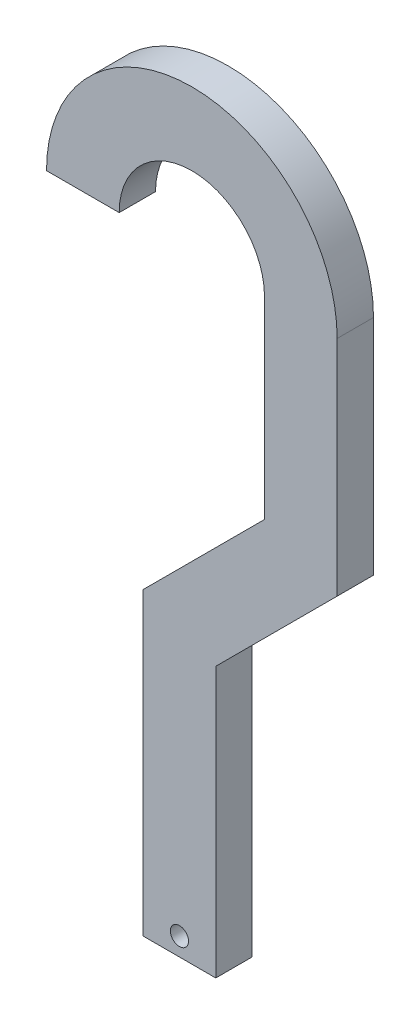
ISO-10303-21;
HEADER;
FILE_DESCRIPTION(('STEP AP214'),'2;1');
FILE_NAME('part.step','',(''),(''),'','','');
FILE_SCHEMA(('AUTOMOTIVE_DESIGN { 1 0 10303 214 1 1 1 1 }'));
ENDSEC;
DATA;
#1=APPLICATION_CONTEXT('core data for automotive mechanical design processes');
#2=APPLICATION_PROTOCOL_DEFINITION('international standard','automotive_design',2000,#1);
#3=PRODUCT_CONTEXT('',#1,'mechanical');
#4=PRODUCT('Part','Part','',(#3));
#5=PRODUCT_RELATED_PRODUCT_CATEGORY('part','',(#4));
#6=PRODUCT_DEFINITION_FORMATION('','',#4);
#7=PRODUCT_DEFINITION_CONTEXT('part definition',#1,'design');
#8=PRODUCT_DEFINITION('design','',#6,#7);
#9=PRODUCT_DEFINITION_SHAPE('','',#8);
#10=(LENGTH_UNIT() NAMED_UNIT(*) SI_UNIT(.MILLI.,.METRE.));
#11=(NAMED_UNIT(*) PLANE_ANGLE_UNIT() SI_UNIT($,.RADIAN.));
#12=(NAMED_UNIT(*) SI_UNIT($,.STERADIAN.) SOLID_ANGLE_UNIT());
#13=UNCERTAINTY_MEASURE_WITH_UNIT(LENGTH_MEASURE(1.E-05),#10,'distance_accuracy_value','');
#14=(GEOMETRIC_REPRESENTATION_CONTEXT(3) GLOBAL_UNCERTAINTY_ASSIGNED_CONTEXT((#13)) GLOBAL_UNIT_ASSIGNED_CONTEXT((#10,
#11,#12)) REPRESENTATION_CONTEXT('',''));
#15=CARTESIAN_POINT('',(0.,0.,0.));
#16=DIRECTION('',(0.,0.,1.));
#17=DIRECTION('',(1.,0.,0.));
#18=AXIS2_PLACEMENT_3D('',#15,#16,#17);
#19=CARTESIAN_POINT('',(-67.8353919429378,-180.765389633672,12.7));
#20=DIRECTION('',(0.,1.,0.));
#21=DIRECTION('',(-1.,0.,0.));
#22=AXIS2_PLACEMENT_3D('',#19,#20,#21);
#23=PLANE('',#22);
#24=DIRECTION('',(1.,0.,0.));
#25=VECTOR('',#24,1.);
#26=CARTESIAN_POINT('',(-67.8353919429378,-180.765389633672,0.));
#27=LINE('',#26,#25);
#28=CARTESIAN_POINT('',(-67.8353919429378,-180.765389633672,0.));
#29=VERTEX_POINT('',#28);
#30=CARTESIAN_POINT('',(-42.4353919429378,-180.765389633672,0.));
#31=VERTEX_POINT('',#30);
#32=EDGE_CURVE('E151',#29,#31,#27,.T.);
#33=ORIENTED_EDGE('',*,*,#32,.T.);
#34=DIRECTION('',(0.,0.,-1.));
#35=VECTOR('',#34,1.);
#36=CARTESIAN_POINT('',(-42.4353919429378,-180.765389633672,12.7));
#37=LINE('',#36,#35);
#38=CARTESIAN_POINT('',(-42.4353919429378,-180.765389633672,12.7));
#39=VERTEX_POINT('',#38);
#40=EDGE_CURVE('E11',#39,#31,#37,.T.);
#41=ORIENTED_EDGE('',*,*,#40,.F.);
#42=DIRECTION('',(1.,0.,0.));
#43=VECTOR('',#42,1.);
#44=CARTESIAN_POINT('',(-67.8353919429378,-180.765389633672,12.7));
#45=LINE('',#44,#43);
#46=CARTESIAN_POINT('',(-67.8353919429378,-180.765389633672,12.7));
#47=VERTEX_POINT('',#46);
#48=EDGE_CURVE('E186',#47,#39,#45,.T.);
#49=ORIENTED_EDGE('',*,*,#48,.F.);
#50=DIRECTION('',(0.,0.,-1.));
#51=VECTOR('',#50,1.);
#52=CARTESIAN_POINT('',(-67.8353919429378,-180.765389633672,12.7));
#53=LINE('',#52,#51);
#54=EDGE_CURVE('E147',#47,#29,#53,.T.);
#55=ORIENTED_EDGE('',*,*,#54,.T.);
#56=EDGE_LOOP('',(#33,#41,#49,#55));
#57=FACE_BOUND('',#56,.T.);
#58=ADVANCED_FACE('F38',(#57),#23,.F.);
#59=CARTESIAN_POINT('',(-42.4353919429378,-180.765389633672,12.7));
#60=DIRECTION('',(-1.,0.,0.));
#61=DIRECTION('',(0.,0.,1.));
#62=AXIS2_PLACEMENT_3D('',#59,#60,#61);
#63=PLANE('',#62);
#64=DIRECTION('',(0.,1.,0.));
#65=VECTOR('',#64,1.);
#66=CARTESIAN_POINT('',(-42.4353919429378,-180.765389633672,0.));
#67=LINE('',#66,#65);
#68=CARTESIAN_POINT('',(-42.4353919429378,-86.3902671664381,0.));
#69=VERTEX_POINT('',#68);
#70=EDGE_CURVE('E155',#31,#69,#67,.T.);
#71=ORIENTED_EDGE('',*,*,#70,.T.);
#72=DIRECTION('',(0.,0.,-1.));
#73=VECTOR('',#72,1.);
#74=CARTESIAN_POINT('',(-42.4353919429378,-86.3902671664381,12.7));
#75=LINE('',#74,#73);
#76=CARTESIAN_POINT('',(-42.4353919429378,-86.3902671664381,12.7));
#77=VERTEX_POINT('',#76);
#78=EDGE_CURVE('E47',#77,#69,#75,.T.);
#79=ORIENTED_EDGE('',*,*,#78,.F.);
#80=DIRECTION('',(0.,1.,0.));
#81=VECTOR('',#80,1.);
#82=CARTESIAN_POINT('',(-42.4353919429378,-180.765389633672,12.7));
#83=LINE('',#82,#81);
#84=EDGE_CURVE('E102',#39,#77,#83,.T.);
#85=ORIENTED_EDGE('',*,*,#84,.F.);
#86=ORIENTED_EDGE('',*,*,#40,.T.);
#87=EDGE_LOOP('',(#71,#79,#85,#86));
#88=FACE_BOUND('',#87,.T.);
#89=ADVANCED_FACE('F270',(#88),#63,.F.);
#90=CARTESIAN_POINT('',(-42.4353919429378,-86.3902671664381,12.7));
#91=DIRECTION('',(-0.707106781186546,0.707106781186549,0.));
#92=DIRECTION('',(-0.707106781186549,-0.707106781186546,0.));
#93=AXIS2_PLACEMENT_3D('',#90,#91,#92);
#94=PLANE('',#93);
#95=DIRECTION('',(0.707106781186549,0.707106781186546,0.));
#96=VECTOR('',#95,1.);
#97=CARTESIAN_POINT('',(-42.4353919429378,-86.3902671664381,0.));
#98=LINE('',#97,#96);
#99=CARTESIAN_POINT('',(0.,-43.9548752235004,0.));
#100=VERTEX_POINT('',#99);
#101=EDGE_CURVE('E159',#69,#100,#98,.T.);
#102=ORIENTED_EDGE('',*,*,#101,.T.);
#103=DIRECTION('',(0.,0.,-1.));
#104=VECTOR('',#103,1.);
#105=CARTESIAN_POINT('',(0.,-43.9548752235004,12.7));
#106=LINE('',#105,#104);
#107=CARTESIAN_POINT('',(0.,-43.9548752235004,12.7));
#108=VERTEX_POINT('',#107);
#109=EDGE_CURVE('E202',#108,#100,#106,.T.);
#110=ORIENTED_EDGE('',*,*,#109,.F.);
#111=DIRECTION('',(0.707106781186549,0.707106781186546,0.));
#112=VECTOR('',#111,1.);
#113=CARTESIAN_POINT('',(-42.4353919429378,-86.3902671664381,12.7));
#114=LINE('',#113,#112);
#115=EDGE_CURVE('E212',#77,#108,#114,.T.);
#116=ORIENTED_EDGE('',*,*,#115,.F.);
#117=ORIENTED_EDGE('',*,*,#78,.T.);
#118=EDGE_LOOP('',(#102,#110,#116,#117));
#119=FACE_BOUND('',#118,.T.);
#120=ADVANCED_FACE('F210',(#119),#94,.F.);
#121=CARTESIAN_POINT('',(0.,0.,12.7));
#122=DIRECTION('',(-1.,0.,0.));
#123=DIRECTION('',(0.,0.,1.));
#124=AXIS2_PLACEMENT_3D('',#121,#122,#123);
#125=PLANE('',#124);
#126=DIRECTION('',(0.,1.,0.));
#127=VECTOR('',#126,1.);
#128=CARTESIAN_POINT('',(0.,0.,0.));
#129=LINE('',#128,#127);
#130=CARTESIAN_POINT('',(0.,34.062325918048,0.));
#131=VERTEX_POINT('',#130);
#132=EDGE_CURVE('E163',#100,#131,#129,.T.);
#133=ORIENTED_EDGE('',*,*,#132,.T.);
#134=DIRECTION('',(0.,0.,-1.));
#135=VECTOR('',#134,1.);
#136=CARTESIAN_POINT('',(0.,34.062325918048,12.7));
#137=LINE('',#136,#135);
#138=CARTESIAN_POINT('',(0.,34.062325918048,12.7));
#139=VERTEX_POINT('',#138);
#140=EDGE_CURVE('E199',#139,#131,#137,.T.);
#141=ORIENTED_EDGE('',*,*,#140,.F.);
#142=DIRECTION('',(0.,1.,0.));
#143=VECTOR('',#142,1.);
#144=CARTESIAN_POINT('',(0.,-43.9548752235004,12.7));
#145=LINE('',#144,#143);
#146=EDGE_CURVE('E221',#108,#139,#145,.T.);
#147=ORIENTED_EDGE('',*,*,#146,.F.);
#148=ORIENTED_EDGE('',*,*,#109,.T.);
#149=EDGE_LOOP('',(#133,#141,#147,#148));
#150=FACE_BOUND('',#149,.T.);
#151=ADVANCED_FACE('F218',(#150),#125,.F.);
#152=CARTESIAN_POINT('',(-50.8,34.062325918048,12.7));
#153=DIRECTION('',(0.,0.,-1.));
#154=DIRECTION('',(-1.,0.,0.));
#155=AXIS2_PLACEMENT_3D('',#152,#153,#154);
#156=CYLINDRICAL_SURFACE('',#155,50.8);
#157=CARTESIAN_POINT('',(-50.8,34.062325918048,0.));
#158=DIRECTION('',(0.,0.,-1.));
#159=DIRECTION('',(-1.,0.,0.));
#160=AXIS2_PLACEMENT_3D('',#157,#158,#159);
#161=CIRCLE('',#160,50.8);
#162=CARTESIAN_POINT('',(-101.6,34.062325918048,0.));
#163=VERTEX_POINT('',#162);
#164=EDGE_CURVE('E167',#163,#131,#161,.T.);
#165=ORIENTED_EDGE('',*,*,#164,.F.);
#166=DIRECTION('',(0.,0.,-1.));
#167=VECTOR('',#166,1.);
#168=CARTESIAN_POINT('',(-101.6,34.062325918048,12.7));
#169=LINE('',#168,#167);
#170=CARTESIAN_POINT('',(-101.6,34.062325918048,12.7));
#171=VERTEX_POINT('',#170);
#172=EDGE_CURVE('E196',#171,#163,#169,.T.);
#173=ORIENTED_EDGE('',*,*,#172,.F.);
#174=CARTESIAN_POINT('',(-50.8,34.062325918048,12.7));
#175=DIRECTION('',(0.,0.,-1.));
#176=DIRECTION('',(-1.,0.,0.));
#177=AXIS2_PLACEMENT_3D('',#174,#175,#176);
#178=CIRCLE('',#177,50.8);
#179=EDGE_CURVE('E224',#171,#139,#178,.T.);
#180=ORIENTED_EDGE('',*,*,#179,.T.);
#181=ORIENTED_EDGE('',*,*,#140,.T.);
#182=EDGE_LOOP('',(#165,#173,#180,#181));
#183=FACE_BOUND('',#182,.T.);
#184=ADVANCED_FACE('F281',(#183),#156,.T.);
#185=CARTESIAN_POINT('',(-101.6,34.062325918048,12.7));
#186=DIRECTION('',(0.,1.,0.));
#187=DIRECTION('',(0.,0.,1.));
#188=AXIS2_PLACEMENT_3D('',#185,#186,#187);
#189=PLANE('',#188);
#190=DIRECTION('',(1.,0.,0.));
#191=VECTOR('',#190,1.);
#192=CARTESIAN_POINT('',(-101.6,34.062325918048,0.));
#193=LINE('',#192,#191);
#194=CARTESIAN_POINT('',(-76.2,34.062325918048,0.));
#195=VERTEX_POINT('',#194);
#196=EDGE_CURVE('E171',#163,#195,#193,.T.);
#197=ORIENTED_EDGE('',*,*,#196,.T.);
#198=DIRECTION('',(0.,0.,-1.));
#199=VECTOR('',#198,1.);
#200=CARTESIAN_POINT('',(-76.2,34.062325918048,12.7));
#201=LINE('',#200,#199);
#202=CARTESIAN_POINT('',(-76.2,34.062325918048,12.7));
#203=VERTEX_POINT('',#202);
#204=EDGE_CURVE('E193',#203,#195,#201,.T.);
#205=ORIENTED_EDGE('',*,*,#204,.F.);
#206=DIRECTION('',(1.,0.,0.));
#207=VECTOR('',#206,1.);
#208=CARTESIAN_POINT('',(-101.6,34.062325918048,12.7));
#209=LINE('',#208,#207);
#210=EDGE_CURVE('E228',#171,#203,#209,.T.);
#211=ORIENTED_EDGE('',*,*,#210,.F.);
#212=ORIENTED_EDGE('',*,*,#172,.T.);
#213=EDGE_LOOP('',(#197,#205,#211,#212));
#214=FACE_BOUND('',#213,.T.);
#215=ADVANCED_FACE('F284',(#214),#189,.F.);
#216=CARTESIAN_POINT('',(-50.8,34.062325918048,12.7));
#217=DIRECTION('',(0.,0.,-1.));
#218=DIRECTION('',(-1.,0.,0.));
#219=AXIS2_PLACEMENT_3D('',#216,#217,#218);
#220=CYLINDRICAL_SURFACE('',#219,25.4);
#221=CARTESIAN_POINT('',(-50.8,34.062325918048,0.));
#222=DIRECTION('',(0.,0.,1.));
#223=DIRECTION('',(1.,0.,0.));
#224=AXIS2_PLACEMENT_3D('',#221,#222,#223);
#225=CIRCLE('',#224,25.4);
#226=CARTESIAN_POINT('',(-25.4,34.062325918048,0.));
#227=VERTEX_POINT('',#226);
#228=EDGE_CURVE('E175',#227,#195,#225,.T.);
#229=ORIENTED_EDGE('',*,*,#228,.F.);
#230=DIRECTION('',(0.,0.,-1.));
#231=VECTOR('',#230,1.);
#232=CARTESIAN_POINT('',(-25.4,34.062325918048,12.7));
#233=LINE('',#232,#231);
#234=CARTESIAN_POINT('',(-25.4,34.062325918048,12.7));
#235=VERTEX_POINT('',#234);
#236=EDGE_CURVE('E140',#235,#227,#233,.T.);
#237=ORIENTED_EDGE('',*,*,#236,.F.);
#238=CARTESIAN_POINT('',(-50.8,34.062325918048,12.7));
#239=DIRECTION('',(0.,0.,1.));
#240=DIRECTION('',(1.,0.,0.));
#241=AXIS2_PLACEMENT_3D('',#238,#239,#240);
#242=CIRCLE('',#241,25.4);
#243=EDGE_CURVE('E129',#235,#203,#242,.T.);
#244=ORIENTED_EDGE('',*,*,#243,.T.);
#245=ORIENTED_EDGE('',*,*,#204,.T.);
#246=EDGE_LOOP('',(#229,#237,#244,#245));
#247=FACE_BOUND('',#246,.T.);
#248=ADVANCED_FACE('F237',(#247),#220,.F.);
#249=CARTESIAN_POINT('',(-25.4,6.39132624653613,12.7));
#250=DIRECTION('',(1.,0.,0.));
#251=DIRECTION('',(0.,1.,0.));
#252=AXIS2_PLACEMENT_3D('',#249,#250,#251);
#253=PLANE('',#252);
#254=DIRECTION('',(0.,-1.,0.));
#255=VECTOR('',#254,1.);
#256=CARTESIAN_POINT('',(-25.4,6.39132624653613,0.));
#257=LINE('',#256,#255);
#258=CARTESIAN_POINT('',(-25.4,-33.4338507392238,0.));
#259=VERTEX_POINT('',#258);
#260=EDGE_CURVE('E137',#227,#259,#257,.T.);
#261=ORIENTED_EDGE('',*,*,#260,.T.);
#262=DIRECTION('',(0.,0.,-1.));
#263=VECTOR('',#262,1.);
#264=CARTESIAN_POINT('',(-25.4,-33.4338507392238,12.7));
#265=LINE('',#264,#263);
#266=CARTESIAN_POINT('',(-25.4,-33.4338507392238,12.7));
#267=VERTEX_POINT('',#266);
#268=EDGE_CURVE('E135',#267,#259,#265,.T.);
#269=ORIENTED_EDGE('',*,*,#268,.F.);
#270=DIRECTION('',(0.,1.,0.));
#271=VECTOR('',#270,1.);
#272=CARTESIAN_POINT('',(-25.4,6.39132624653613,12.7));
#273=LINE('',#272,#271);
#274=EDGE_CURVE('E122',#267,#235,#273,.T.);
#275=ORIENTED_EDGE('',*,*,#274,.T.);
#276=ORIENTED_EDGE('',*,*,#236,.T.);
#277=EDGE_LOOP('',(#261,#269,#275,#276));
#278=FACE_BOUND('',#277,.T.);
#279=ADVANCED_FACE('F136',(#278),#253,.F.);
#280=CARTESIAN_POINT('',(-25.4,-33.4338507392238,12.7));
#281=DIRECTION('',(0.707106781186547,-0.707106781186548,0.));
#282=DIRECTION('',(0.707106781186548,0.707106781186547,0.));
#283=AXIS2_PLACEMENT_3D('',#280,#281,#282);
#284=PLANE('',#283);
#285=DIRECTION('',(-0.707106781186549,-0.707106781186547,0.));
#286=VECTOR('',#285,1.);
#287=CARTESIAN_POINT('',(-25.4,-33.4338507392238,0.));
#288=LINE('',#287,#286);
#289=CARTESIAN_POINT('',(-67.8353919429378,-75.8692426821615,0.));
#290=VERTEX_POINT('',#289);
#291=EDGE_CURVE('E181',#259,#290,#288,.T.);
#292=ORIENTED_EDGE('',*,*,#291,.T.);
#293=DIRECTION('',(0.,0.,-1.));
#294=VECTOR('',#293,1.);
#295=CARTESIAN_POINT('',(-67.8353919429378,-75.8692426821615,12.7));
#296=LINE('',#295,#294);
#297=CARTESIAN_POINT('',(-67.8353919429378,-75.8692426821615,12.7));
#298=VERTEX_POINT('',#297);
#299=EDGE_CURVE('E141',#298,#290,#296,.T.);
#300=ORIENTED_EDGE('',*,*,#299,.F.);
#301=DIRECTION('',(-0.707106781186549,-0.707106781186547,0.));
#302=VECTOR('',#301,1.);
#303=CARTESIAN_POINT('',(-25.4,-33.4338507392238,12.7));
#304=LINE('',#303,#302);
#305=EDGE_CURVE('E126',#267,#298,#304,.T.);
#306=ORIENTED_EDGE('',*,*,#305,.F.);
#307=ORIENTED_EDGE('',*,*,#268,.T.);
#308=EDGE_LOOP('',(#292,#300,#306,#307));
#309=FACE_BOUND('',#308,.T.);
#310=ADVANCED_FACE('F143',(#309),#284,.F.);
#311=CARTESIAN_POINT('',(-67.8353919429378,-100.403593512164,12.7));
#312=DIRECTION('',(1.,0.,0.));
#313=DIRECTION('',(0.,1.,0.));
#314=AXIS2_PLACEMENT_3D('',#311,#312,#313);
#315=PLANE('',#314);
#316=DIRECTION('',(0.,-1.,0.));
#317=VECTOR('',#316,1.);
#318=CARTESIAN_POINT('',(-67.8353919429378,-100.403593512164,0.));
#319=LINE('',#318,#317);
#320=EDGE_CURVE('E90',#290,#29,#319,.T.);
#321=ORIENTED_EDGE('',*,*,#320,.T.);
#322=ORIENTED_EDGE('',*,*,#54,.F.);
#323=DIRECTION('',(0.,-1.,0.));
#324=VECTOR('',#323,1.);
#325=CARTESIAN_POINT('',(-67.8353919429378,-75.8692426821615,12.7));
#326=LINE('',#325,#324);
#327=EDGE_CURVE('E55',#298,#47,#326,.T.);
#328=ORIENTED_EDGE('',*,*,#327,.F.);
#329=ORIENTED_EDGE('',*,*,#299,.T.);
#330=EDGE_LOOP('',(#321,#322,#328,#329));
#331=FACE_BOUND('',#330,.T.);
#332=ADVANCED_FACE('F239',(#331),#315,.F.);
#333=CARTESIAN_POINT('',(-50.8,34.062325918048,12.7));
#334=DIRECTION('',(0.,0.,-1.));
#335=DIRECTION('',(-1.,0.,0.));
#336=AXIS2_PLACEMENT_3D('',#333,#334,#335);
#337=PLANE('',#336);
#338=CARTESIAN_POINT('',(-55.1353919429378,-174.415389633672,12.7));
#339=DIRECTION('',(0.,0.,1.));
#340=DIRECTION('',(1.,0.,0.));
#341=AXIS2_PLACEMENT_3D('',#338,#339,#340);
#342=CIRCLE('',#341,3.175);
#343=CARTESIAN_POINT('',(-51.9603919429378,-174.415389633672,12.7));
#344=VERTEX_POINT('',#343);
#345=EDGE_CURVE('E250',#344,#344,#342,.T.);
#346=ORIENTED_EDGE('',*,*,#345,.F.);
#347=EDGE_LOOP('',(#346));
#348=FACE_BOUND('',#347,.T.);
#349=ORIENTED_EDGE('',*,*,#48,.T.);
#350=ORIENTED_EDGE('',*,*,#84,.T.);
#351=ORIENTED_EDGE('',*,*,#115,.T.);
#352=ORIENTED_EDGE('',*,*,#146,.T.);
#353=ORIENTED_EDGE('',*,*,#179,.F.);
#354=ORIENTED_EDGE('',*,*,#210,.T.);
#355=ORIENTED_EDGE('',*,*,#243,.F.);
#356=ORIENTED_EDGE('',*,*,#274,.F.);
#357=ORIENTED_EDGE('',*,*,#305,.T.);
#358=ORIENTED_EDGE('',*,*,#327,.T.);
#359=EDGE_LOOP('',(#349,#350,#351,#352,#353,#354,#355,#356,#357,#358));
#360=FACE_BOUND('',#359,.T.);
#361=ADVANCED_FACE('F124',(#348,#360),#337,.F.);
#362=CARTESIAN_POINT('',(-50.8,34.062325918048,0.));
#363=DIRECTION('',(0.,0.,-1.));
#364=DIRECTION('',(-1.,0.,0.));
#365=AXIS2_PLACEMENT_3D('',#362,#363,#364);
#366=PLANE('',#365);
#367=CARTESIAN_POINT('',(-55.1353919429378,-174.415389633672,0.));
#368=DIRECTION('',(0.,0.,-1.));
#369=DIRECTION('',(-1.,0.,0.));
#370=AXIS2_PLACEMENT_3D('',#367,#368,#369);
#371=CIRCLE('',#370,3.175);
#372=CARTESIAN_POINT('',(-58.3103919429378,-174.415389633672,0.));
#373=VERTEX_POINT('',#372);
#374=EDGE_CURVE('E156',#373,#373,#371,.F.);
#375=ORIENTED_EDGE('',*,*,#374,.T.);
#376=EDGE_LOOP('',(#375));
#377=FACE_BOUND('',#376,.T.);
#378=ORIENTED_EDGE('',*,*,#32,.F.);
#379=ORIENTED_EDGE('',*,*,#320,.F.);
#380=ORIENTED_EDGE('',*,*,#291,.F.);
#381=ORIENTED_EDGE('',*,*,#260,.F.);
#382=ORIENTED_EDGE('',*,*,#228,.T.);
#383=ORIENTED_EDGE('',*,*,#196,.F.);
#384=ORIENTED_EDGE('',*,*,#164,.T.);
#385=ORIENTED_EDGE('',*,*,#132,.F.);
#386=ORIENTED_EDGE('',*,*,#101,.F.);
#387=ORIENTED_EDGE('',*,*,#70,.F.);
#388=EDGE_LOOP('',(#378,#379,#380,#381,#382,#383,#384,#385,#386,#387));
#389=FACE_BOUND('',#388,.T.);
#390=ADVANCED_FACE('F213',(#377,#389),#366,.T.);
#391=CARTESIAN_POINT('',(-55.1353919429378,-174.415389633672,-8.98025612106913));
#392=DIRECTION('',(0.,0.,1.));
#393=DIRECTION('',(1.,0.,0.));
#394=AXIS2_PLACEMENT_3D('',#391,#392,#393);
#395=CYLINDRICAL_SURFACE('',#394,3.175);
#396=ORIENTED_EDGE('',*,*,#345,.T.);
#397=EDGE_LOOP('',(#396));
#398=FACE_BOUND('',#397,.T.);
#399=ORIENTED_EDGE('',*,*,#374,.F.);
#400=EDGE_LOOP('',(#399));
#401=FACE_BOUND('',#400,.T.);
#402=ADVANCED_FACE('F255',(#398,#401),#395,.F.);
#403=CLOSED_SHELL('',(#58,#89,#120,#151,#184,#215,#248,#279,#310,#332,#361,#390,#402));
#404=MANIFOLD_SOLID_BREP('B2',#403);
#405=ADVANCED_BREP_SHAPE_REPRESENTATION('',(#18,#404),#14);
#406=SHAPE_DEFINITION_REPRESENTATION(#9,#405);
ENDSEC;
END-ISO-10303-21;
